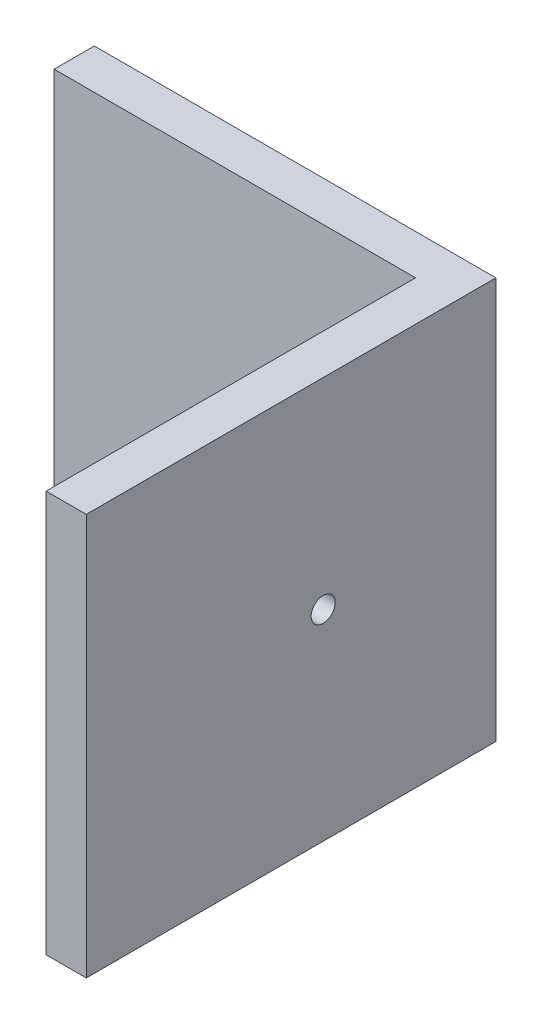
ISO-10303-21;
HEADER;
FILE_DESCRIPTION(('STEP AP214'),'2;1');
FILE_NAME('part.step','',(''),(''),'','','');
FILE_SCHEMA(('AUTOMOTIVE_DESIGN { 1 0 10303 214 1 1 1 1 }'));
ENDSEC;
DATA;
#1=APPLICATION_CONTEXT('core data for automotive mechanical design processes');
#2=APPLICATION_PROTOCOL_DEFINITION('international standard','automotive_design',2000,#1);
#3=PRODUCT_CONTEXT('',#1,'mechanical');
#4=PRODUCT('Part','Part','',(#3));
#5=PRODUCT_RELATED_PRODUCT_CATEGORY('part','',(#4));
#6=PRODUCT_DEFINITION_FORMATION('','',#4);
#7=PRODUCT_DEFINITION_CONTEXT('part definition',#1,'design');
#8=PRODUCT_DEFINITION('design','',#6,#7);
#9=PRODUCT_DEFINITION_SHAPE('','',#8);
#10=(LENGTH_UNIT() NAMED_UNIT(*) SI_UNIT(.MILLI.,.METRE.));
#11=(NAMED_UNIT(*) PLANE_ANGLE_UNIT() SI_UNIT($,.RADIAN.));
#12=(NAMED_UNIT(*) SI_UNIT($,.STERADIAN.) SOLID_ANGLE_UNIT());
#13=UNCERTAINTY_MEASURE_WITH_UNIT(LENGTH_MEASURE(1.E-05),#10,'distance_accuracy_value','');
#14=(GEOMETRIC_REPRESENTATION_CONTEXT(3) GLOBAL_UNCERTAINTY_ASSIGNED_CONTEXT((#13)) GLOBAL_UNIT_ASSIGNED_CONTEXT((#10,
#11,#12)) REPRESENTATION_CONTEXT('',''));
#15=CARTESIAN_POINT('',(0.,0.,0.));
#16=DIRECTION('',(0.,0.,1.));
#17=DIRECTION('',(1.,0.,0.));
#18=AXIS2_PLACEMENT_3D('',#15,#16,#17);
#19=CARTESIAN_POINT('',(0.,-25.,5.));
#20=DIRECTION('',(0.,1.,0.));
#21=DIRECTION('',(0.,0.,1.));
#22=AXIS2_PLACEMENT_3D('',#19,#20,#21);
#23=PLANE('',#22);
#24=DIRECTION('',(1.,0.,0.));
#25=VECTOR('',#24,1.);
#26=CARTESIAN_POINT('',(0.,-25.,0.));
#27=LINE('',#26,#25);
#28=CARTESIAN_POINT('',(-25.,-25.,0.));
#29=VERTEX_POINT('',#28);
#30=CARTESIAN_POINT('',(25.,-25.,0.));
#31=VERTEX_POINT('',#30);
#32=EDGE_CURVE('E104',#29,#31,#27,.T.);
#33=ORIENTED_EDGE('',*,*,#32,.T.);
#34=DIRECTION('',(0.,0.,-1.));
#35=VECTOR('',#34,1.);
#36=CARTESIAN_POINT('',(25.,-25.,51.));
#37=LINE('',#36,#35);
#38=CARTESIAN_POINT('',(25.,-25.,51.));
#39=VERTEX_POINT('',#38);
#40=EDGE_CURVE('E110',#39,#31,#37,.T.);
#41=ORIENTED_EDGE('',*,*,#40,.F.);
#42=DIRECTION('',(1.,0.,0.));
#43=VECTOR('',#42,1.);
#44=CARTESIAN_POINT('',(0.,-25.,51.));
#45=LINE('',#44,#43);
#46=CARTESIAN_POINT('',(20.,-25.,51.));
#47=VERTEX_POINT('',#46);
#48=EDGE_CURVE('E256',#47,#39,#45,.T.);
#49=ORIENTED_EDGE('',*,*,#48,.F.);
#50=DIRECTION('',(0.,0.,-1.));
#51=VECTOR('',#50,1.);
#52=CARTESIAN_POINT('',(20.,-25.,51.));
#53=LINE('',#52,#51);
#54=CARTESIAN_POINT('',(20.,-25.,5.));
#55=VERTEX_POINT('',#54);
#56=EDGE_CURVE('E105',#47,#55,#53,.T.);
#57=ORIENTED_EDGE('',*,*,#56,.T.);
#58=DIRECTION('',(1.,0.,0.));
#59=VECTOR('',#58,1.);
#60=CARTESIAN_POINT('',(0.,-25.,5.));
#61=LINE('',#60,#59);
#62=CARTESIAN_POINT('',(-25.,-25.,5.));
#63=VERTEX_POINT('',#62);
#64=EDGE_CURVE('E72',#63,#55,#61,.T.);
#65=ORIENTED_EDGE('',*,*,#64,.F.);
#66=DIRECTION('',(0.,0.,-1.));
#67=VECTOR('',#66,1.);
#68=CARTESIAN_POINT('',(-25.,-25.,5.));
#69=LINE('',#68,#67);
#70=EDGE_CURVE('E50',#63,#29,#69,.T.);
#71=ORIENTED_EDGE('',*,*,#70,.T.);
#72=EDGE_LOOP('',(#33,#41,#49,#57,#65,#71));
#73=FACE_BOUND('',#72,.T.);
#74=ADVANCED_FACE('F41',(#73),#23,.F.);
#75=CARTESIAN_POINT('',(0.,25.,5.));
#76=DIRECTION('',(0.,1.,0.));
#77=DIRECTION('',(0.,0.,1.));
#78=AXIS2_PLACEMENT_3D('',#75,#76,#77);
#79=PLANE('',#78);
#80=DIRECTION('',(1.,0.,0.));
#81=VECTOR('',#80,1.);
#82=CARTESIAN_POINT('',(0.,25.,0.));
#83=LINE('',#82,#81);
#84=CARTESIAN_POINT('',(-25.,25.,0.));
#85=VERTEX_POINT('',#84);
#86=CARTESIAN_POINT('',(25.,25.,0.));
#87=VERTEX_POINT('',#86);
#88=EDGE_CURVE('E108',#85,#87,#83,.T.);
#89=ORIENTED_EDGE('',*,*,#88,.F.);
#90=DIRECTION('',(0.,0.,-1.));
#91=VECTOR('',#90,1.);
#92=CARTESIAN_POINT('',(-25.,25.,5.));
#93=LINE('',#92,#91);
#94=CARTESIAN_POINT('',(-25.,25.,5.));
#95=VERTEX_POINT('',#94);
#96=EDGE_CURVE('E11',#95,#85,#93,.T.);
#97=ORIENTED_EDGE('',*,*,#96,.F.);
#98=DIRECTION('',(1.,0.,0.));
#99=VECTOR('',#98,1.);
#100=CARTESIAN_POINT('',(0.,25.,5.));
#101=LINE('',#100,#99);
#102=CARTESIAN_POINT('',(20.,25.,5.));
#103=VERTEX_POINT('',#102);
#104=EDGE_CURVE('E85',#95,#103,#101,.T.);
#105=ORIENTED_EDGE('',*,*,#104,.T.);
#106=DIRECTION('',(0.,0.,-1.));
#107=VECTOR('',#106,1.);
#108=CARTESIAN_POINT('',(20.,25.,51.));
#109=LINE('',#108,#107);
#110=CARTESIAN_POINT('',(20.,25.,51.));
#111=VERTEX_POINT('',#110);
#112=EDGE_CURVE('E96',#111,#103,#109,.T.);
#113=ORIENTED_EDGE('',*,*,#112,.F.);
#114=DIRECTION('',(1.,0.,0.));
#115=VECTOR('',#114,1.);
#116=CARTESIAN_POINT('',(0.,25.,51.));
#117=LINE('',#116,#115);
#118=CARTESIAN_POINT('',(25.,25.,51.));
#119=VERTEX_POINT('',#118);
#120=EDGE_CURVE('E250',#111,#119,#117,.T.);
#121=ORIENTED_EDGE('',*,*,#120,.T.);
#122=DIRECTION('',(0.,0.,-1.));
#123=VECTOR('',#122,1.);
#124=CARTESIAN_POINT('',(25.,25.,51.));
#125=LINE('',#124,#123);
#126=EDGE_CURVE('E260',#119,#87,#125,.T.);
#127=ORIENTED_EDGE('',*,*,#126,.T.);
#128=EDGE_LOOP('',(#89,#97,#105,#113,#121,#127));
#129=FACE_BOUND('',#128,.T.);
#130=ADVANCED_FACE('F93',(#129),#79,.T.);
#131=CARTESIAN_POINT('',(-25.,0.,5.));
#132=DIRECTION('',(-1.,0.,0.));
#133=DIRECTION('',(0.,0.,1.));
#134=AXIS2_PLACEMENT_3D('',#131,#132,#133);
#135=PLANE('',#134);
#136=DIRECTION('',(0.,1.,0.));
#137=VECTOR('',#136,1.);
#138=CARTESIAN_POINT('',(-25.,0.,0.));
#139=LINE('',#138,#137);
#140=EDGE_CURVE('E122',#29,#85,#139,.T.);
#141=ORIENTED_EDGE('',*,*,#140,.F.);
#142=ORIENTED_EDGE('',*,*,#70,.F.);
#143=DIRECTION('',(0.,1.,0.));
#144=VECTOR('',#143,1.);
#145=CARTESIAN_POINT('',(-25.,0.,5.));
#146=LINE('',#145,#144);
#147=EDGE_CURVE('E98',#63,#95,#146,.T.);
#148=ORIENTED_EDGE('',*,*,#147,.T.);
#149=ORIENTED_EDGE('',*,*,#96,.T.);
#150=EDGE_LOOP('',(#141,#142,#148,#149));
#151=FACE_BOUND('',#150,.T.);
#152=ADVANCED_FACE('F138',(#151),#135,.T.);
#153=CARTESIAN_POINT('',(9.50000000000002,0.,5.));
#154=DIRECTION('',(0.,0.,-1.));
#155=DIRECTION('',(-1.,0.,0.));
#156=AXIS2_PLACEMENT_3D('',#153,#154,#155);
#157=CYLINDRICAL_SURFACE('',#156,1.5);
#158=CARTESIAN_POINT('',(9.50000000000002,0.,5.));
#159=DIRECTION('',(0.,0.,1.));
#160=DIRECTION('',(1.,0.,0.));
#161=AXIS2_PLACEMENT_3D('',#158,#159,#160);
#162=CIRCLE('',#161,1.5);
#163=CARTESIAN_POINT('',(11.,0.,5.));
#164=VERTEX_POINT('',#163);
#165=EDGE_CURVE('E117',#164,#164,#162,.T.);
#166=ORIENTED_EDGE('',*,*,#165,.T.);
#167=EDGE_LOOP('',(#166));
#168=FACE_BOUND('',#167,.T.);
#169=CARTESIAN_POINT('',(9.50000000000002,0.,0.));
#170=DIRECTION('',(0.,0.,1.));
#171=DIRECTION('',(1.,0.,0.));
#172=AXIS2_PLACEMENT_3D('',#169,#170,#171);
#173=CIRCLE('',#172,1.5);
#174=CARTESIAN_POINT('',(11.,0.,0.));
#175=VERTEX_POINT('',#174);
#176=EDGE_CURVE('E114',#175,#175,#173,.T.);
#177=ORIENTED_EDGE('',*,*,#176,.F.);
#178=EDGE_LOOP('',(#177));
#179=FACE_BOUND('',#178,.T.);
#180=ADVANCED_FACE('F140',(#168,#179),#157,.F.);
#181=CARTESIAN_POINT('',(0.,0.,5.));
#182=DIRECTION('',(0.,0.,1.));
#183=DIRECTION('',(1.,0.,0.));
#184=AXIS2_PLACEMENT_3D('',#181,#182,#183);
#185=PLANE('',#184);
#186=ORIENTED_EDGE('',*,*,#64,.T.);
#187=DIRECTION('',(0.,-1.,0.));
#188=VECTOR('',#187,1.);
#189=CARTESIAN_POINT('',(20.,0.,5.));
#190=LINE('',#189,#188);
#191=EDGE_CURVE('E81',#103,#55,#190,.T.);
#192=ORIENTED_EDGE('',*,*,#191,.F.);
#193=ORIENTED_EDGE('',*,*,#104,.F.);
#194=ORIENTED_EDGE('',*,*,#147,.F.);
#195=EDGE_LOOP('',(#186,#192,#193,#194));
#196=FACE_BOUND('',#195,.T.);
#197=ORIENTED_EDGE('',*,*,#165,.F.);
#198=EDGE_LOOP('',(#197));
#199=FACE_BOUND('',#198,.T.);
#200=ADVANCED_FACE('F83',(#196,#199),#185,.T.);
#201=CARTESIAN_POINT('',(0.,0.,0.));
#202=DIRECTION('',(0.,0.,1.));
#203=DIRECTION('',(1.,0.,0.));
#204=AXIS2_PLACEMENT_3D('',#201,#202,#203);
#205=PLANE('',#204);
#206=ORIENTED_EDGE('',*,*,#32,.F.);
#207=ORIENTED_EDGE('',*,*,#140,.T.);
#208=ORIENTED_EDGE('',*,*,#88,.T.);
#209=DIRECTION('',(0.,1.,0.));
#210=VECTOR('',#209,1.);
#211=CARTESIAN_POINT('',(25.,0.,0.));
#212=LINE('',#211,#210);
#213=EDGE_CURVE('E137',#31,#87,#212,.T.);
#214=ORIENTED_EDGE('',*,*,#213,.F.);
#215=EDGE_LOOP('',(#206,#207,#208,#214));
#216=FACE_BOUND('',#215,.T.);
#217=ORIENTED_EDGE('',*,*,#176,.T.);
#218=EDGE_LOOP('',(#217));
#219=FACE_BOUND('',#218,.T.);
#220=ADVANCED_FACE('F134',(#216,#219),#205,.F.);
#221=CARTESIAN_POINT('',(20.,0.,51.));
#222=DIRECTION('',(1.,0.,0.));
#223=DIRECTION('',(0.,1.,0.));
#224=AXIS2_PLACEMENT_3D('',#221,#222,#223);
#225=PLANE('',#224);
#226=CARTESIAN_POINT('',(20.,0.,21.5));
#227=DIRECTION('',(-1.,0.,0.));
#228=DIRECTION('',(0.,-1.,0.));
#229=AXIS2_PLACEMENT_3D('',#226,#227,#228);
#230=CIRCLE('',#229,1.5);
#231=CARTESIAN_POINT('',(20.,-1.5,21.5));
#232=VERTEX_POINT('',#231);
#233=EDGE_CURVE('E247',#232,#232,#230,.T.);
#234=ORIENTED_EDGE('',*,*,#233,.F.);
#235=EDGE_LOOP('',(#234));
#236=FACE_BOUND('',#235,.T.);
#237=ORIENTED_EDGE('',*,*,#112,.T.);
#238=ORIENTED_EDGE('',*,*,#191,.T.);
#239=ORIENTED_EDGE('',*,*,#56,.F.);
#240=DIRECTION('',(0.,-1.,0.));
#241=VECTOR('',#240,1.);
#242=CARTESIAN_POINT('',(20.,0.,51.));
#243=LINE('',#242,#241);
#244=EDGE_CURVE('E102',#111,#47,#243,.T.);
#245=ORIENTED_EDGE('',*,*,#244,.F.);
#246=EDGE_LOOP('',(#237,#238,#239,#245));
#247=FACE_BOUND('',#246,.T.);
#248=ADVANCED_FACE('F100',(#236,#247),#225,.F.);
#249=CARTESIAN_POINT('',(25.,0.,51.));
#250=DIRECTION('',(-1.,0.,0.));
#251=DIRECTION('',(0.,0.,1.));
#252=AXIS2_PLACEMENT_3D('',#249,#250,#251);
#253=PLANE('',#252);
#254=CARTESIAN_POINT('',(25.,0.,21.5));
#255=DIRECTION('',(-1.,0.,0.));
#256=DIRECTION('',(0.,0.,1.));
#257=AXIS2_PLACEMENT_3D('',#254,#255,#256);
#258=CIRCLE('',#257,1.5);
#259=CARTESIAN_POINT('',(25.,0.,23.));
#260=VERTEX_POINT('',#259);
#261=EDGE_CURVE('E44',#260,#260,#258,.T.);
#262=ORIENTED_EDGE('',*,*,#261,.T.);
#263=EDGE_LOOP('',(#262));
#264=FACE_BOUND('',#263,.T.);
#265=ORIENTED_EDGE('',*,*,#213,.T.);
#266=ORIENTED_EDGE('',*,*,#126,.F.);
#267=DIRECTION('',(0.,1.,0.));
#268=VECTOR('',#267,1.);
#269=CARTESIAN_POINT('',(25.,0.,51.));
#270=LINE('',#269,#268);
#271=EDGE_CURVE('E259',#39,#119,#270,.T.);
#272=ORIENTED_EDGE('',*,*,#271,.F.);
#273=ORIENTED_EDGE('',*,*,#40,.T.);
#274=EDGE_LOOP('',(#265,#266,#272,#273));
#275=FACE_BOUND('',#274,.T.);
#276=ADVANCED_FACE('F182',(#264,#275),#253,.F.);
#277=CARTESIAN_POINT('',(0.,0.,51.));
#278=DIRECTION('',(0.,0.,1.));
#279=DIRECTION('',(1.,0.,0.));
#280=AXIS2_PLACEMENT_3D('',#277,#278,#279);
#281=PLANE('',#280);
#282=ORIENTED_EDGE('',*,*,#120,.F.);
#283=ORIENTED_EDGE('',*,*,#244,.T.);
#284=ORIENTED_EDGE('',*,*,#48,.T.);
#285=ORIENTED_EDGE('',*,*,#271,.T.);
#286=EDGE_LOOP('',(#282,#283,#284,#285));
#287=FACE_BOUND('',#286,.T.);
#288=ADVANCED_FACE('F177',(#287),#281,.T.);
#289=CARTESIAN_POINT('',(30.,0.,21.5));
#290=DIRECTION('',(-1.,0.,0.));
#291=DIRECTION('',(0.,-1.,0.));
#292=AXIS2_PLACEMENT_3D('',#289,#290,#291);
#293=CYLINDRICAL_SURFACE('',#292,1.5);
#294=ORIENTED_EDGE('',*,*,#233,.T.);
#295=EDGE_LOOP('',(#294));
#296=FACE_BOUND('',#295,.T.);
#297=ORIENTED_EDGE('',*,*,#261,.F.);
#298=EDGE_LOOP('',(#297));
#299=FACE_BOUND('',#298,.T.);
#300=ADVANCED_FACE('F181',(#296,#299),#293,.F.);
#301=CLOSED_SHELL('',(#74,#130,#152,#180,#200,#220,#248,#276,#288,#300));
#302=MANIFOLD_SOLID_BREP('B2',#301);
#303=ADVANCED_BREP_SHAPE_REPRESENTATION('',(#18,#302),#14);
#304=SHAPE_DEFINITION_REPRESENTATION(#9,#303);
ENDSEC;
END-ISO-10303-21;
